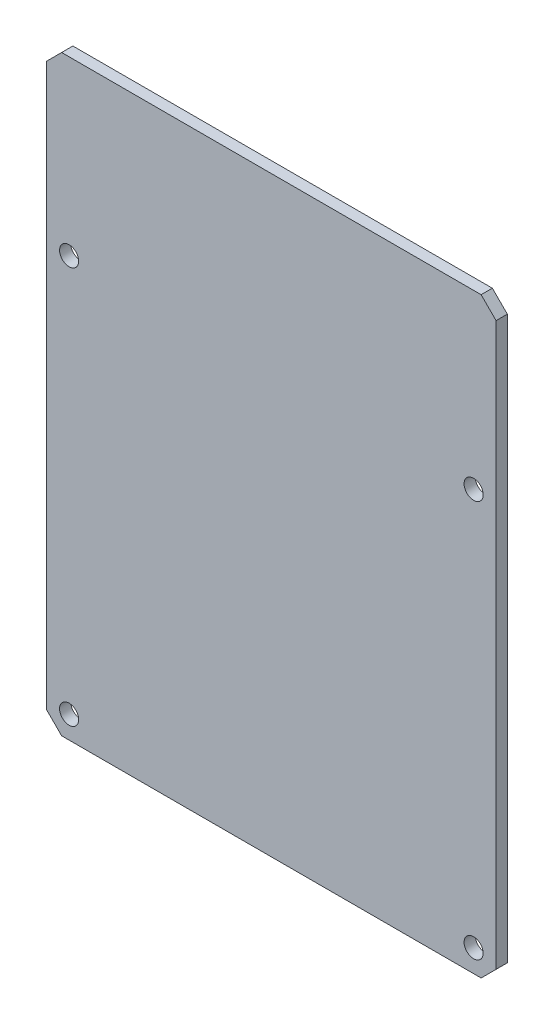
ISO-10303-21;
HEADER;
FILE_DESCRIPTION(('STEP AP214'),'2;1');
FILE_NAME('part.step','',(''),(''),'','','');
FILE_SCHEMA(('AUTOMOTIVE_DESIGN { 1 0 10303 214 1 1 1 1 }'));
ENDSEC;
DATA;
#1=APPLICATION_CONTEXT('core data for automotive mechanical design processes');
#2=APPLICATION_PROTOCOL_DEFINITION('international standard','automotive_design',2000,#1);
#3=PRODUCT_CONTEXT('',#1,'mechanical');
#4=PRODUCT('Part','Part','',(#3));
#5=PRODUCT_RELATED_PRODUCT_CATEGORY('part','',(#4));
#6=PRODUCT_DEFINITION_FORMATION('','',#4);
#7=PRODUCT_DEFINITION_CONTEXT('part definition',#1,'design');
#8=PRODUCT_DEFINITION('design','',#6,#7);
#9=PRODUCT_DEFINITION_SHAPE('','',#8);
#10=(LENGTH_UNIT() NAMED_UNIT(*) SI_UNIT(.MILLI.,.METRE.));
#11=(NAMED_UNIT(*) PLANE_ANGLE_UNIT() SI_UNIT($,.RADIAN.));
#12=(NAMED_UNIT(*) SI_UNIT($,.STERADIAN.) SOLID_ANGLE_UNIT());
#13=UNCERTAINTY_MEASURE_WITH_UNIT(LENGTH_MEASURE(1.E-05),#10,'distance_accuracy_value','');
#14=(GEOMETRIC_REPRESENTATION_CONTEXT(3) GLOBAL_UNCERTAINTY_ASSIGNED_CONTEXT((#13)) GLOBAL_UNIT_ASSIGNED_CONTEXT((#10,
#11,#12)) REPRESENTATION_CONTEXT('',''));
#15=CARTESIAN_POINT('',(0.,0.,0.));
#16=DIRECTION('',(0.,0.,1.));
#17=DIRECTION('',(1.,0.,0.));
#18=AXIS2_PLACEMENT_3D('',#15,#16,#17);
#19=CARTESIAN_POINT('',(30.,-39.5,1.5));
#20=DIRECTION('',(-1.,0.,0.));
#21=DIRECTION('',(0.,0.,1.));
#22=AXIS2_PLACEMENT_3D('',#19,#20,#21);
#23=PLANE('',#22);
#24=DIRECTION('',(0.,1.,0.));
#25=VECTOR('',#24,1.);
#26=CARTESIAN_POINT('',(30.,-39.5,1.5));
#27=LINE('',#26,#25);
#28=CARTESIAN_POINT('',(30.,-37.5,1.5));
#29=VERTEX_POINT('',#28);
#30=CARTESIAN_POINT('',(30.,37.5,1.5));
#31=VERTEX_POINT('',#30);
#32=EDGE_CURVE('E131',#29,#31,#27,.T.);
#33=ORIENTED_EDGE('',*,*,#32,.F.);
#34=DIRECTION('',(0.,0.,-1.));
#35=VECTOR('',#34,1.);
#36=CARTESIAN_POINT('',(30.,-37.5,1.5));
#37=LINE('',#36,#35);
#38=CARTESIAN_POINT('',(30.,-37.5,0.));
#39=VERTEX_POINT('',#38);
#40=EDGE_CURVE('E11',#29,#39,#37,.T.);
#41=ORIENTED_EDGE('',*,*,#40,.T.);
#42=DIRECTION('',(0.,1.,0.));
#43=VECTOR('',#42,1.);
#44=CARTESIAN_POINT('',(30.,-39.5,0.));
#45=LINE('',#44,#43);
#46=CARTESIAN_POINT('',(30.,37.5,0.));
#47=VERTEX_POINT('',#46);
#48=EDGE_CURVE('E162',#39,#47,#45,.T.);
#49=ORIENTED_EDGE('',*,*,#48,.T.);
#50=DIRECTION('',(0.,0.,1.));
#51=VECTOR('',#50,1.);
#52=CARTESIAN_POINT('',(30.,37.5,1.5));
#53=LINE('',#52,#51);
#54=EDGE_CURVE('E45',#47,#31,#53,.T.);
#55=ORIENTED_EDGE('',*,*,#54,.T.);
#56=EDGE_LOOP('',(#33,#41,#49,#55));
#57=FACE_BOUND('',#56,.T.);
#58=ADVANCED_FACE('F36',(#57),#23,.F.);
#59=CARTESIAN_POINT('',(-30.,39.5,1.5));
#60=DIRECTION('',(0.,-1.,0.));
#61=DIRECTION('',(0.,0.,-1.));
#62=AXIS2_PLACEMENT_3D('',#59,#60,#61);
#63=PLANE('',#62);
#64=DIRECTION('',(-1.,0.,0.));
#65=VECTOR('',#64,1.);
#66=CARTESIAN_POINT('',(-30.,39.5,0.));
#67=LINE('',#66,#65);
#68=CARTESIAN_POINT('',(28.,39.5,0.));
#69=VERTEX_POINT('',#68);
#70=CARTESIAN_POINT('',(-28.,39.5,0.));
#71=VERTEX_POINT('',#70);
#72=EDGE_CURVE('E136',#69,#71,#67,.T.);
#73=ORIENTED_EDGE('',*,*,#72,.T.);
#74=DIRECTION('',(0.,0.,1.));
#75=VECTOR('',#74,1.);
#76=CARTESIAN_POINT('',(-28.,39.5,1.5));
#77=LINE('',#76,#75);
#78=CARTESIAN_POINT('',(-28.,39.5,1.5));
#79=VERTEX_POINT('',#78);
#80=EDGE_CURVE('E52',#71,#79,#77,.T.);
#81=ORIENTED_EDGE('',*,*,#80,.T.);
#82=DIRECTION('',(-1.,0.,0.));
#83=VECTOR('',#82,1.);
#84=CARTESIAN_POINT('',(-30.,39.5,1.5));
#85=LINE('',#84,#83);
#86=CARTESIAN_POINT('',(28.,39.5,1.5));
#87=VERTEX_POINT('',#86);
#88=EDGE_CURVE('E134',#87,#79,#85,.T.);
#89=ORIENTED_EDGE('',*,*,#88,.F.);
#90=DIRECTION('',(0.,0.,-1.));
#91=VECTOR('',#90,1.);
#92=CARTESIAN_POINT('',(28.,39.5,1.5));
#93=LINE('',#92,#91);
#94=EDGE_CURVE('E154',#87,#69,#93,.T.);
#95=ORIENTED_EDGE('',*,*,#94,.T.);
#96=EDGE_LOOP('',(#73,#81,#89,#95));
#97=FACE_BOUND('',#96,.T.);
#98=ADVANCED_FACE('F169',(#97),#63,.F.);
#99=CARTESIAN_POINT('',(-30.,-39.5,1.5));
#100=DIRECTION('',(1.,0.,0.));
#101=DIRECTION('',(0.,0.,-1.));
#102=AXIS2_PLACEMENT_3D('',#99,#100,#101);
#103=PLANE('',#102);
#104=DIRECTION('',(0.,-1.,0.));
#105=VECTOR('',#104,1.);
#106=CARTESIAN_POINT('',(-30.,-39.5,0.));
#107=LINE('',#106,#105);
#108=CARTESIAN_POINT('',(-30.,37.5,0.));
#109=VERTEX_POINT('',#108);
#110=CARTESIAN_POINT('',(-30.,-37.5,0.));
#111=VERTEX_POINT('',#110);
#112=EDGE_CURVE('E132',#109,#111,#107,.T.);
#113=ORIENTED_EDGE('',*,*,#112,.T.);
#114=DIRECTION('',(0.,0.,1.));
#115=VECTOR('',#114,1.);
#116=CARTESIAN_POINT('',(-30.,-37.5,1.5));
#117=LINE('',#116,#115);
#118=CARTESIAN_POINT('',(-30.,-37.5,1.5));
#119=VERTEX_POINT('',#118);
#120=EDGE_CURVE('E109',#111,#119,#117,.T.);
#121=ORIENTED_EDGE('',*,*,#120,.T.);
#122=DIRECTION('',(0.,-1.,0.));
#123=VECTOR('',#122,1.);
#124=CARTESIAN_POINT('',(-30.,-39.5,1.5));
#125=LINE('',#124,#123);
#126=CARTESIAN_POINT('',(-30.,37.5,1.5));
#127=VERTEX_POINT('',#126);
#128=EDGE_CURVE('E174',#127,#119,#125,.T.);
#129=ORIENTED_EDGE('',*,*,#128,.F.);
#130=DIRECTION('',(0.,0.,-1.));
#131=VECTOR('',#130,1.);
#132=CARTESIAN_POINT('',(-30.,37.5,1.5));
#133=LINE('',#132,#131);
#134=EDGE_CURVE('E114',#127,#109,#133,.T.);
#135=ORIENTED_EDGE('',*,*,#134,.T.);
#136=EDGE_LOOP('',(#113,#121,#129,#135));
#137=FACE_BOUND('',#136,.T.);
#138=ADVANCED_FACE('F231',(#137),#103,.F.);
#139=CARTESIAN_POINT('',(-30.,-39.5,1.5));
#140=DIRECTION('',(0.,1.,0.));
#141=DIRECTION('',(0.,0.,1.));
#142=AXIS2_PLACEMENT_3D('',#139,#140,#141);
#143=PLANE('',#142);
#144=DIRECTION('',(1.,0.,0.));
#145=VECTOR('',#144,1.);
#146=CARTESIAN_POINT('',(-30.,-39.5,1.5));
#147=LINE('',#146,#145);
#148=CARTESIAN_POINT('',(-28.,-39.5,1.5));
#149=VERTEX_POINT('',#148);
#150=CARTESIAN_POINT('',(28.,-39.5,1.5));
#151=VERTEX_POINT('',#150);
#152=EDGE_CURVE('E124',#149,#151,#147,.T.);
#153=ORIENTED_EDGE('',*,*,#152,.F.);
#154=DIRECTION('',(0.,0.,-1.));
#155=VECTOR('',#154,1.);
#156=CARTESIAN_POINT('',(-28.,-39.5,1.5));
#157=LINE('',#156,#155);
#158=CARTESIAN_POINT('',(-28.,-39.5,0.));
#159=VERTEX_POINT('',#158);
#160=EDGE_CURVE('E108',#149,#159,#157,.T.);
#161=ORIENTED_EDGE('',*,*,#160,.T.);
#162=DIRECTION('',(1.,0.,0.));
#163=VECTOR('',#162,1.);
#164=CARTESIAN_POINT('',(-30.,-39.5,0.));
#165=LINE('',#164,#163);
#166=CARTESIAN_POINT('',(28.,-39.5,0.));
#167=VERTEX_POINT('',#166);
#168=EDGE_CURVE('E121',#159,#167,#165,.T.);
#169=ORIENTED_EDGE('',*,*,#168,.T.);
#170=DIRECTION('',(0.,0.,1.));
#171=VECTOR('',#170,1.);
#172=CARTESIAN_POINT('',(28.,-39.5,1.5));
#173=LINE('',#172,#171);
#174=EDGE_CURVE('E126',#167,#151,#173,.T.);
#175=ORIENTED_EDGE('',*,*,#174,.T.);
#176=EDGE_LOOP('',(#153,#161,#169,#175));
#177=FACE_BOUND('',#176,.T.);
#178=ADVANCED_FACE('F120',(#177),#143,.F.);
#179=CARTESIAN_POINT('',(0.,0.,1.5));
#180=DIRECTION('',(0.,0.,-1.));
#181=DIRECTION('',(-1.,0.,0.));
#182=AXIS2_PLACEMENT_3D('',#179,#180,#181);
#183=PLANE('',#182);
#184=CARTESIAN_POINT('',(-27.,16.5,1.5));
#185=DIRECTION('',(0.,0.,1.));
#186=DIRECTION('',(1.,0.,0.));
#187=AXIS2_PLACEMENT_3D('',#184,#185,#186);
#188=CIRCLE('',#187,1.275);
#189=CARTESIAN_POINT('',(-25.725,16.5,1.5));
#190=VERTEX_POINT('',#189);
#191=EDGE_CURVE('E197',#190,#190,#188,.T.);
#192=ORIENTED_EDGE('',*,*,#191,.F.);
#193=EDGE_LOOP('',(#192));
#194=FACE_BOUND('',#193,.T.);
#195=CARTESIAN_POINT('',(27.,16.5,1.5));
#196=DIRECTION('',(0.,0.,1.));
#197=DIRECTION('',(1.,0.,0.));
#198=AXIS2_PLACEMENT_3D('',#195,#196,#197);
#199=CIRCLE('',#198,1.275);
#200=CARTESIAN_POINT('',(28.275,16.5,1.5));
#201=VERTEX_POINT('',#200);
#202=EDGE_CURVE('E191',#201,#201,#199,.T.);
#203=ORIENTED_EDGE('',*,*,#202,.F.);
#204=EDGE_LOOP('',(#203));
#205=FACE_BOUND('',#204,.T.);
#206=CARTESIAN_POINT('',(27.,-36.5,1.5));
#207=DIRECTION('',(0.,0.,1.));
#208=DIRECTION('',(1.,0.,0.));
#209=AXIS2_PLACEMENT_3D('',#206,#207,#208);
#210=CIRCLE('',#209,1.275);
#211=CARTESIAN_POINT('',(28.275,-36.5,1.5));
#212=VERTEX_POINT('',#211);
#213=EDGE_CURVE('E185',#212,#212,#210,.T.);
#214=ORIENTED_EDGE('',*,*,#213,.F.);
#215=EDGE_LOOP('',(#214));
#216=FACE_BOUND('',#215,.T.);
#217=CARTESIAN_POINT('',(-27.,-36.5,1.5));
#218=DIRECTION('',(0.,0.,1.));
#219=DIRECTION('',(1.,0.,0.));
#220=AXIS2_PLACEMENT_3D('',#217,#218,#219);
#221=CIRCLE('',#220,1.275);
#222=CARTESIAN_POINT('',(-25.725,-36.5,1.5));
#223=VERTEX_POINT('',#222);
#224=EDGE_CURVE('E179',#223,#223,#221,.T.);
#225=ORIENTED_EDGE('',*,*,#224,.F.);
#226=EDGE_LOOP('',(#225));
#227=FACE_BOUND('',#226,.T.);
#228=ORIENTED_EDGE('',*,*,#128,.T.);
#229=DIRECTION('',(-0.707106781186548,0.707106781186548,0.));
#230=VECTOR('',#229,1.);
#231=CARTESIAN_POINT('',(-28.,-39.5,1.5));
#232=LINE('',#231,#230);
#233=EDGE_CURVE('E152',#119,#149,#232,.F.);
#234=ORIENTED_EDGE('',*,*,#233,.T.);
#235=ORIENTED_EDGE('',*,*,#152,.T.);
#236=DIRECTION('',(-0.70710678118655,-0.707106781186545,0.));
#237=VECTOR('',#236,1.);
#238=CARTESIAN_POINT('',(30.,-37.5,1.5));
#239=LINE('',#238,#237);
#240=EDGE_CURVE('E148',#151,#29,#239,.F.);
#241=ORIENTED_EDGE('',*,*,#240,.T.);
#242=ORIENTED_EDGE('',*,*,#32,.T.);
#243=DIRECTION('',(0.707106781186548,-0.707106781186548,0.));
#244=VECTOR('',#243,1.);
#245=CARTESIAN_POINT('',(28.,39.5,1.5));
#246=LINE('',#245,#244);
#247=EDGE_CURVE('E59',#31,#87,#246,.F.);
#248=ORIENTED_EDGE('',*,*,#247,.T.);
#249=ORIENTED_EDGE('',*,*,#88,.T.);
#250=DIRECTION('',(0.707106781186548,0.707106781186548,0.));
#251=VECTOR('',#250,1.);
#252=CARTESIAN_POINT('',(-30.,37.5,1.5));
#253=LINE('',#252,#251);
#254=EDGE_CURVE('E150',#79,#127,#253,.F.);
#255=ORIENTED_EDGE('',*,*,#254,.T.);
#256=EDGE_LOOP('',(#228,#234,#235,#241,#242,#248,#249,#255));
#257=FACE_BOUND('',#256,.T.);
#258=ADVANCED_FACE('F165',(#194,#205,#216,#227,#257),#183,.F.);
#259=CARTESIAN_POINT('',(0.,0.,0.));
#260=DIRECTION('',(0.,0.,-1.));
#261=DIRECTION('',(-1.,0.,0.));
#262=AXIS2_PLACEMENT_3D('',#259,#260,#261);
#263=PLANE('',#262);
#264=CARTESIAN_POINT('',(-27.,16.5,0.));
#265=DIRECTION('',(0.,0.,1.));
#266=DIRECTION('',(1.,0.,0.));
#267=AXIS2_PLACEMENT_3D('',#264,#265,#266);
#268=CIRCLE('',#267,1.275);
#269=CARTESIAN_POINT('',(-25.725,16.5,0.));
#270=VERTEX_POINT('',#269);
#271=EDGE_CURVE('E194',#270,#270,#268,.T.);
#272=ORIENTED_EDGE('',*,*,#271,.T.);
#273=EDGE_LOOP('',(#272));
#274=FACE_BOUND('',#273,.T.);
#275=CARTESIAN_POINT('',(27.,16.5,0.));
#276=DIRECTION('',(0.,0.,1.));
#277=DIRECTION('',(1.,0.,0.));
#278=AXIS2_PLACEMENT_3D('',#275,#276,#277);
#279=CIRCLE('',#278,1.275);
#280=CARTESIAN_POINT('',(28.275,16.5,0.));
#281=VERTEX_POINT('',#280);
#282=EDGE_CURVE('E188',#281,#281,#279,.T.);
#283=ORIENTED_EDGE('',*,*,#282,.T.);
#284=EDGE_LOOP('',(#283));
#285=FACE_BOUND('',#284,.T.);
#286=CARTESIAN_POINT('',(27.,-36.5,0.));
#287=DIRECTION('',(0.,0.,1.));
#288=DIRECTION('',(1.,0.,0.));
#289=AXIS2_PLACEMENT_3D('',#286,#287,#288);
#290=CIRCLE('',#289,1.275);
#291=CARTESIAN_POINT('',(28.275,-36.5,0.));
#292=VERTEX_POINT('',#291);
#293=EDGE_CURVE('E182',#292,#292,#290,.T.);
#294=ORIENTED_EDGE('',*,*,#293,.T.);
#295=EDGE_LOOP('',(#294));
#296=FACE_BOUND('',#295,.T.);
#297=CARTESIAN_POINT('',(-27.,-36.5,0.));
#298=DIRECTION('',(0.,0.,1.));
#299=DIRECTION('',(1.,0.,0.));
#300=AXIS2_PLACEMENT_3D('',#297,#298,#299);
#301=CIRCLE('',#300,1.275);
#302=CARTESIAN_POINT('',(-25.725,-36.5,0.));
#303=VERTEX_POINT('',#302);
#304=EDGE_CURVE('E170',#303,#303,#301,.T.);
#305=ORIENTED_EDGE('',*,*,#304,.T.);
#306=EDGE_LOOP('',(#305));
#307=FACE_BOUND('',#306,.T.);
#308=ORIENTED_EDGE('',*,*,#168,.F.);
#309=DIRECTION('',(0.707106781186548,-0.707106781186548,0.));
#310=VECTOR('',#309,1.);
#311=CARTESIAN_POINT('',(-33.75,-33.75,0.));
#312=LINE('',#311,#310);
#313=EDGE_CURVE('E104',#159,#111,#312,.F.);
#314=ORIENTED_EDGE('',*,*,#313,.T.);
#315=ORIENTED_EDGE('',*,*,#112,.F.);
#316=DIRECTION('',(-0.707106781186548,-0.707106781186548,0.));
#317=VECTOR('',#316,1.);
#318=CARTESIAN_POINT('',(-33.75,33.75,0.));
#319=LINE('',#318,#317);
#320=EDGE_CURVE('E115',#109,#71,#319,.F.);
#321=ORIENTED_EDGE('',*,*,#320,.T.);
#322=ORIENTED_EDGE('',*,*,#72,.F.);
#323=DIRECTION('',(-0.707106781186548,0.707106781186548,0.));
#324=VECTOR('',#323,1.);
#325=CARTESIAN_POINT('',(33.75,33.75,0.));
#326=LINE('',#325,#324);
#327=EDGE_CURVE('E125',#69,#47,#326,.F.);
#328=ORIENTED_EDGE('',*,*,#327,.T.);
#329=ORIENTED_EDGE('',*,*,#48,.F.);
#330=DIRECTION('',(0.70710678118655,0.707106781186545,0.));
#331=VECTOR('',#330,1.);
#332=CARTESIAN_POINT('',(33.7499999999999,-33.7500000000001,0.));
#333=LINE('',#332,#331);
#334=EDGE_CURVE('E130',#39,#167,#333,.F.);
#335=ORIENTED_EDGE('',*,*,#334,.T.);
#336=EDGE_LOOP('',(#308,#314,#315,#321,#322,#328,#329,#335));
#337=FACE_BOUND('',#336,.T.);
#338=ADVANCED_FACE('F128',(#274,#285,#296,#307,#337),#263,.T.);
#339=CARTESIAN_POINT('',(-28.,-39.5,1.5));
#340=DIRECTION('',(0.707106781186547,0.707106781186547,0.));
#341=DIRECTION('',(0.,0.,-1.));
#342=AXIS2_PLACEMENT_3D('',#339,#340,#341);
#343=PLANE('',#342);
#344=ORIENTED_EDGE('',*,*,#233,.F.);
#345=ORIENTED_EDGE('',*,*,#120,.F.);
#346=ORIENTED_EDGE('',*,*,#313,.F.);
#347=ORIENTED_EDGE('',*,*,#160,.F.);
#348=EDGE_LOOP('',(#344,#345,#346,#347));
#349=FACE_BOUND('',#348,.T.);
#350=ADVANCED_FACE('F107',(#349),#343,.F.);
#351=CARTESIAN_POINT('',(-30.,37.5,1.5));
#352=DIRECTION('',(0.707106781186547,-0.707106781186547,0.));
#353=DIRECTION('',(0.,0.,-1.));
#354=AXIS2_PLACEMENT_3D('',#351,#352,#353);
#355=PLANE('',#354);
#356=ORIENTED_EDGE('',*,*,#254,.F.);
#357=ORIENTED_EDGE('',*,*,#80,.F.);
#358=ORIENTED_EDGE('',*,*,#320,.F.);
#359=ORIENTED_EDGE('',*,*,#134,.F.);
#360=EDGE_LOOP('',(#356,#357,#358,#359));
#361=FACE_BOUND('',#360,.T.);
#362=ADVANCED_FACE('F241',(#361),#355,.F.);
#363=CARTESIAN_POINT('',(30.,-37.5,1.5));
#364=DIRECTION('',(-0.707106781186545,0.70710678118655,0.));
#365=DIRECTION('',(0.,0.,-1.));
#366=AXIS2_PLACEMENT_3D('',#363,#364,#365);
#367=PLANE('',#366);
#368=ORIENTED_EDGE('',*,*,#240,.F.);
#369=ORIENTED_EDGE('',*,*,#174,.F.);
#370=ORIENTED_EDGE('',*,*,#334,.F.);
#371=ORIENTED_EDGE('',*,*,#40,.F.);
#372=EDGE_LOOP('',(#368,#369,#370,#371));
#373=FACE_BOUND('',#372,.T.);
#374=ADVANCED_FACE('F224',(#373),#367,.F.);
#375=CARTESIAN_POINT('',(28.,39.5,1.5));
#376=DIRECTION('',(-0.707106781186547,-0.707106781186547,0.));
#377=DIRECTION('',(0.,0.,-1.));
#378=AXIS2_PLACEMENT_3D('',#375,#376,#377);
#379=PLANE('',#378);
#380=ORIENTED_EDGE('',*,*,#247,.F.);
#381=ORIENTED_EDGE('',*,*,#54,.F.);
#382=ORIENTED_EDGE('',*,*,#327,.F.);
#383=ORIENTED_EDGE('',*,*,#94,.F.);
#384=EDGE_LOOP('',(#380,#381,#382,#383));
#385=FACE_BOUND('',#384,.T.);
#386=ADVANCED_FACE('F39',(#385),#379,.F.);
#387=CARTESIAN_POINT('',(-27.,-36.5,1.5));
#388=DIRECTION('',(0.,0.,1.));
#389=DIRECTION('',(1.,0.,0.));
#390=AXIS2_PLACEMENT_3D('',#387,#388,#389);
#391=CYLINDRICAL_SURFACE('',#390,1.275);
#392=ORIENTED_EDGE('',*,*,#304,.F.);
#393=EDGE_LOOP('',(#392));
#394=FACE_BOUND('',#393,.T.);
#395=ORIENTED_EDGE('',*,*,#224,.T.);
#396=EDGE_LOOP('',(#395));
#397=FACE_BOUND('',#396,.T.);
#398=ADVANCED_FACE('F212',(#394,#397),#391,.F.);
#399=CARTESIAN_POINT('',(27.,-36.5,1.5));
#400=DIRECTION('',(0.,0.,1.));
#401=DIRECTION('',(1.,0.,0.));
#402=AXIS2_PLACEMENT_3D('',#399,#400,#401);
#403=CYLINDRICAL_SURFACE('',#402,1.275);
#404=ORIENTED_EDGE('',*,*,#293,.F.);
#405=EDGE_LOOP('',(#404));
#406=FACE_BOUND('',#405,.T.);
#407=ORIENTED_EDGE('',*,*,#213,.T.);
#408=EDGE_LOOP('',(#407));
#409=FACE_BOUND('',#408,.T.);
#410=ADVANCED_FACE('F214',(#406,#409),#403,.F.);
#411=CARTESIAN_POINT('',(27.,16.5,1.5));
#412=DIRECTION('',(0.,0.,1.));
#413=DIRECTION('',(1.,0.,0.));
#414=AXIS2_PLACEMENT_3D('',#411,#412,#413);
#415=CYLINDRICAL_SURFACE('',#414,1.275);
#416=ORIENTED_EDGE('',*,*,#282,.F.);
#417=EDGE_LOOP('',(#416));
#418=FACE_BOUND('',#417,.T.);
#419=ORIENTED_EDGE('',*,*,#202,.T.);
#420=EDGE_LOOP('',(#419));
#421=FACE_BOUND('',#420,.T.);
#422=ADVANCED_FACE('F221',(#418,#421),#415,.F.);
#423=CARTESIAN_POINT('',(-27.,16.5,1.5));
#424=DIRECTION('',(0.,0.,1.));
#425=DIRECTION('',(1.,0.,0.));
#426=AXIS2_PLACEMENT_3D('',#423,#424,#425);
#427=CYLINDRICAL_SURFACE('',#426,1.275);
#428=ORIENTED_EDGE('',*,*,#271,.F.);
#429=EDGE_LOOP('',(#428));
#430=FACE_BOUND('',#429,.T.);
#431=ORIENTED_EDGE('',*,*,#191,.T.);
#432=EDGE_LOOP('',(#431));
#433=FACE_BOUND('',#432,.T.);
#434=ADVANCED_FACE('F201',(#430,#433),#427,.F.);
#435=CLOSED_SHELL('',(#58,#98,#138,#178,#258,#338,#350,#362,#374,#386,#398,#410,#422,#434));
#436=MANIFOLD_SOLID_BREP('B2',#435);
#437=ADVANCED_BREP_SHAPE_REPRESENTATION('',(#18,#436),#14);
#438=SHAPE_DEFINITION_REPRESENTATION(#9,#437);
ENDSEC;
END-ISO-10303-21;
